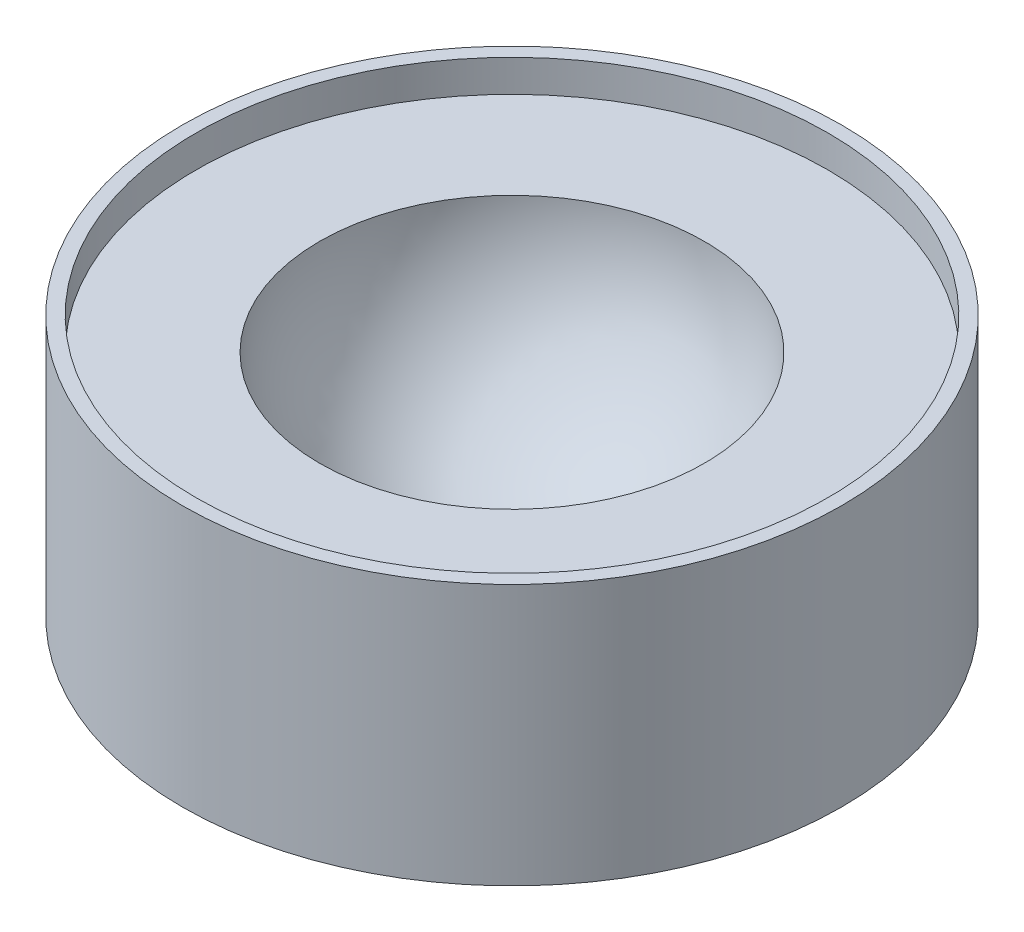
ISO-10303-21;
HEADER;
FILE_DESCRIPTION(('STEP AP214'),'2;1');
FILE_NAME('part.step','',(''),(''),'','','');
FILE_SCHEMA(('AUTOMOTIVE_DESIGN { 1 0 10303 214 1 1 1 1 }'));
ENDSEC;
DATA;
#1=APPLICATION_CONTEXT('core data for automotive mechanical design processes');
#2=APPLICATION_PROTOCOL_DEFINITION('international standard','automotive_design',2000,#1);
#3=PRODUCT_CONTEXT('',#1,'mechanical');
#4=PRODUCT('Part','Part','',(#3));
#5=PRODUCT_RELATED_PRODUCT_CATEGORY('part','',(#4));
#6=PRODUCT_DEFINITION_FORMATION('','',#4);
#7=PRODUCT_DEFINITION_CONTEXT('part definition',#1,'design');
#8=PRODUCT_DEFINITION('design','',#6,#7);
#9=PRODUCT_DEFINITION_SHAPE('','',#8);
#10=(LENGTH_UNIT() NAMED_UNIT(*) SI_UNIT(.MILLI.,.METRE.));
#11=(NAMED_UNIT(*) PLANE_ANGLE_UNIT() SI_UNIT($,.RADIAN.));
#12=(NAMED_UNIT(*) SI_UNIT($,.STERADIAN.) SOLID_ANGLE_UNIT());
#13=UNCERTAINTY_MEASURE_WITH_UNIT(LENGTH_MEASURE(1.E-05),#10,'distance_accuracy_value','');
#14=(GEOMETRIC_REPRESENTATION_CONTEXT(3) GLOBAL_UNCERTAINTY_ASSIGNED_CONTEXT((#13)) GLOBAL_UNIT_ASSIGNED_CONTEXT((#10,
#11,#12)) REPRESENTATION_CONTEXT('',''));
#15=CARTESIAN_POINT('',(0.,0.,0.));
#16=DIRECTION('',(0.,0.,1.));
#17=DIRECTION('',(1.,0.,0.));
#18=AXIS2_PLACEMENT_3D('',#15,#16,#17);
#19=CARTESIAN_POINT('',(0.,50.,0.));
#20=DIRECTION('',(0.,-1.,0.));
#21=DIRECTION('',(0.,0.,-1.));
#22=AXIS2_PLACEMENT_3D('',#19,#20,#21);
#23=CYLINDRICAL_SURFACE('',#22,72.);
#24=CARTESIAN_POINT('',(0.,0.,0.));
#25=DIRECTION('',(0.,1.,0.));
#26=DIRECTION('',(0.,0.,1.));
#27=AXIS2_PLACEMENT_3D('',#24,#25,#26);
#28=CIRCLE('',#27,72.);
#29=CARTESIAN_POINT('',(0.,0.,72.));
#30=VERTEX_POINT('',#29);
#31=EDGE_CURVE('E39',#30,#30,#28,.T.);
#32=ORIENTED_EDGE('',*,*,#31,.T.);
#33=EDGE_LOOP('',(#32));
#34=FACE_BOUND('',#33,.T.);
#35=CARTESIAN_POINT('',(0.,57.,0.));
#36=DIRECTION('',(0.,1.,0.));
#37=DIRECTION('',(0.,0.,1.));
#38=AXIS2_PLACEMENT_3D('',#35,#36,#37);
#39=CIRCLE('',#38,72.);
#40=CARTESIAN_POINT('',(0.,57.,72.));
#41=VERTEX_POINT('',#40);
#42=EDGE_CURVE('E47',#41,#41,#39,.T.);
#43=ORIENTED_EDGE('',*,*,#42,.F.);
#44=EDGE_LOOP('',(#43));
#45=FACE_BOUND('',#44,.T.);
#46=ADVANCED_FACE('F33',(#34,#45),#23,.T.);
#47=CARTESIAN_POINT('',(0.,0.,0.));
#48=DIRECTION('',(0.,1.,0.));
#49=DIRECTION('',(0.,0.,1.));
#50=AXIS2_PLACEMENT_3D('',#47,#48,#49);
#51=PLANE('',#50);
#52=ORIENTED_EDGE('',*,*,#31,.F.);
#53=EDGE_LOOP('',(#52));
#54=FACE_BOUND('',#53,.T.);
#55=ADVANCED_FACE('F60',(#54),#51,.F.);
#56=CARTESIAN_POINT('',(0.,57.,0.));
#57=DIRECTION('',(0.,1.,0.));
#58=DIRECTION('',(0.,0.,1.));
#59=AXIS2_PLACEMENT_3D('',#56,#57,#58);
#60=PLANE('',#59);
#61=ORIENTED_EDGE('',*,*,#42,.T.);
#62=EDGE_LOOP('',(#61));
#63=FACE_BOUND('',#62,.T.);
#64=CARTESIAN_POINT('',(0.,57.,0.));
#65=DIRECTION('',(0.,1.,0.));
#66=DIRECTION('',(0.,0.,1.));
#67=AXIS2_PLACEMENT_3D('',#64,#65,#66);
#68=CIRCLE('',#67,69.);
#69=CARTESIAN_POINT('',(0.,57.,69.));
#70=VERTEX_POINT('',#69);
#71=EDGE_CURVE('E52',#70,#70,#68,.T.);
#72=ORIENTED_EDGE('',*,*,#71,.F.);
#73=EDGE_LOOP('',(#72));
#74=FACE_BOUND('',#73,.T.);
#75=ADVANCED_FACE('F58',(#63,#74),#60,.T.);
#76=CARTESIAN_POINT('',(0.,57.,0.));
#77=DIRECTION('',(0.,-1.,0.));
#78=DIRECTION('',(0.,0.,-1.));
#79=AXIS2_PLACEMENT_3D('',#76,#77,#78);
#80=CYLINDRICAL_SURFACE('',#79,69.);
#81=ORIENTED_EDGE('',*,*,#71,.T.);
#82=EDGE_LOOP('',(#81));
#83=FACE_BOUND('',#82,.T.);
#84=CARTESIAN_POINT('',(0.,50.,0.));
#85=DIRECTION('',(0.,1.,0.));
#86=DIRECTION('',(0.,0.,1.));
#87=AXIS2_PLACEMENT_3D('',#84,#85,#86);
#88=CIRCLE('',#87,69.);
#89=CARTESIAN_POINT('',(0.,50.,69.));
#90=VERTEX_POINT('',#89);
#91=EDGE_CURVE('E10',#90,#90,#88,.F.);
#92=ORIENTED_EDGE('',*,*,#91,.T.);
#93=EDGE_LOOP('',(#92));
#94=FACE_BOUND('',#93,.T.);
#95=ADVANCED_FACE('F56',(#83,#94),#80,.F.);
#96=CARTESIAN_POINT('',(0.,50.,0.));
#97=DIRECTION('',(0.,1.,0.));
#98=DIRECTION('',(-1.,0.,0.));
#99=AXIS2_PLACEMENT_3D('',#96,#97,#98);
#100=SPHERICAL_SURFACE('',#99,42.);
#101=CARTESIAN_POINT('',(0.,50.,0.));
#102=DIRECTION('',(0.,1.,0.));
#103=DIRECTION('',(0.,0.,1.));
#104=AXIS2_PLACEMENT_3D('',#101,#102,#103);
#105=CIRCLE('',#104,42.);
#106=CARTESIAN_POINT('',(0.,50.,42.));
#107=VERTEX_POINT('',#106);
#108=EDGE_CURVE('E43',#107,#107,#105,.T.);
#109=ORIENTED_EDGE('',*,*,#108,.T.);
#110=EDGE_LOOP('',(#109));
#111=FACE_BOUND('',#110,.T.);
#112=ADVANCED_FACE('F67',(#111),#100,.F.);
#113=CARTESIAN_POINT('',(0.,50.,0.));
#114=DIRECTION('',(0.,1.,0.));
#115=DIRECTION('',(0.,0.,1.));
#116=AXIS2_PLACEMENT_3D('',#113,#114,#115);
#117=PLANE('',#116);
#118=ORIENTED_EDGE('',*,*,#108,.F.);
#119=EDGE_LOOP('',(#118));
#120=FACE_BOUND('',#119,.T.);
#121=ORIENTED_EDGE('',*,*,#91,.F.);
#122=EDGE_LOOP('',(#121));
#123=FACE_BOUND('',#122,.T.);
#124=ADVANCED_FACE('F89',(#120,#123),#117,.T.);
#125=CLOSED_SHELL('',(#46,#55,#75,#95,#112,#124));
#126=MANIFOLD_SOLID_BREP('B2',#125);
#127=ADVANCED_BREP_SHAPE_REPRESENTATION('',(#18,#126),#14);
#128=SHAPE_DEFINITION_REPRESENTATION(#9,#127);
ENDSEC;
END-ISO-10303-21;
